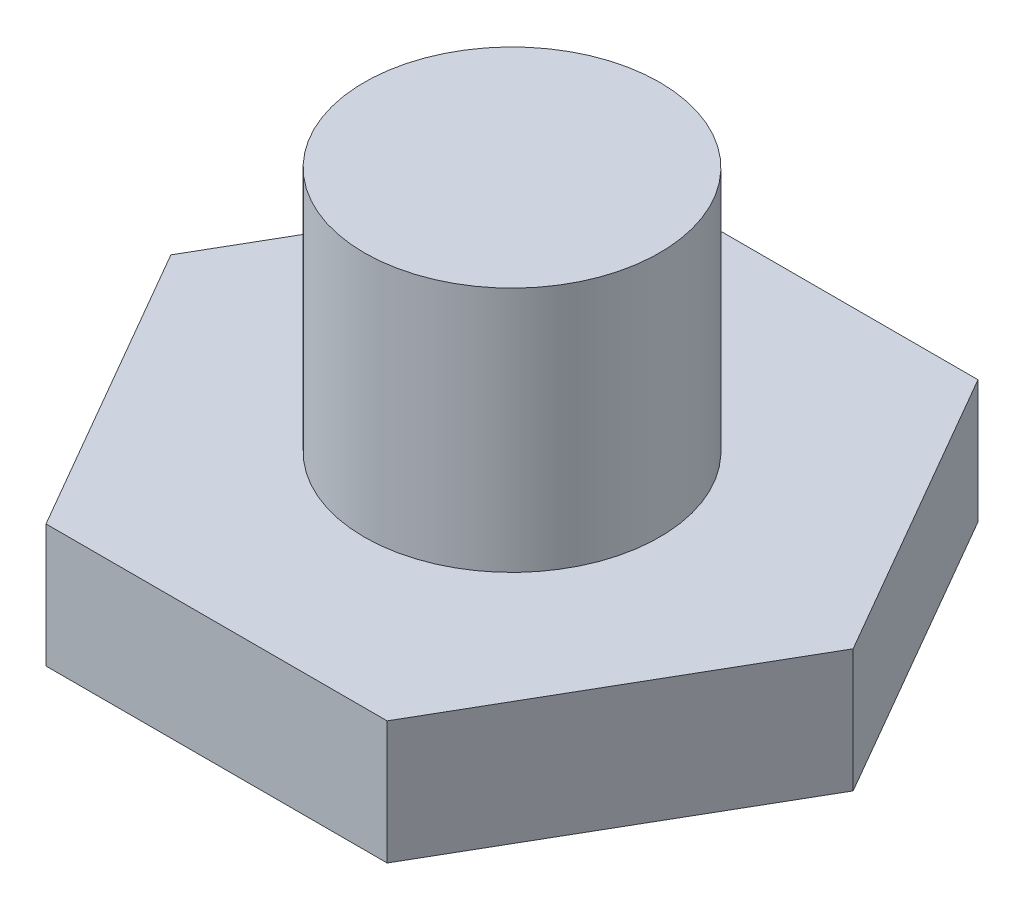
ISO-10303-21;
HEADER;
FILE_DESCRIPTION(('STEP AP214'),'2;1');
FILE_NAME('part.step','',(''),(''),'','','');
FILE_SCHEMA(('AUTOMOTIVE_DESIGN { 1 0 10303 214 1 1 1 1 }'));
ENDSEC;
DATA;
#1=APPLICATION_CONTEXT('core data for automotive mechanical design processes');
#2=APPLICATION_PROTOCOL_DEFINITION('international standard','automotive_design',2000,#1);
#3=PRODUCT_CONTEXT('',#1,'mechanical');
#4=PRODUCT('Part','Part','',(#3));
#5=PRODUCT_RELATED_PRODUCT_CATEGORY('part','',(#4));
#6=PRODUCT_DEFINITION_FORMATION('','',#4);
#7=PRODUCT_DEFINITION_CONTEXT('part definition',#1,'design');
#8=PRODUCT_DEFINITION('design','',#6,#7);
#9=PRODUCT_DEFINITION_SHAPE('','',#8);
#10=(LENGTH_UNIT() NAMED_UNIT(*) SI_UNIT(.MILLI.,.METRE.));
#11=(NAMED_UNIT(*) PLANE_ANGLE_UNIT() SI_UNIT($,.RADIAN.));
#12=(NAMED_UNIT(*) SI_UNIT($,.STERADIAN.) SOLID_ANGLE_UNIT());
#13=UNCERTAINTY_MEASURE_WITH_UNIT(LENGTH_MEASURE(1.E-05),#10,'distance_accuracy_value','');
#14=(GEOMETRIC_REPRESENTATION_CONTEXT(3) GLOBAL_UNCERTAINTY_ASSIGNED_CONTEXT((#13)) GLOBAL_UNIT_ASSIGNED_CONTEXT((#10,
#11,#12)) REPRESENTATION_CONTEXT('',''));
#15=CARTESIAN_POINT('',(0.,0.,0.));
#16=DIRECTION('',(0.,0.,1.));
#17=DIRECTION('',(1.,0.,0.));
#18=AXIS2_PLACEMENT_3D('',#15,#16,#17);
#19=CARTESIAN_POINT('',(6.92820323027565,15.,11.9999999999999));
#20=DIRECTION('',(-0.866025403784441,0.,-0.499999999999995));
#21=DIRECTION('',(-0.499999999999995,0.,0.866025403784442));
#22=AXIS2_PLACEMENT_3D('',#19,#20,#21);
#23=PLANE('',#22);
#24=DIRECTION('',(0.499999999999995,0.,-0.866025403784442));
#25=VECTOR('',#24,1.);
#26=CARTESIAN_POINT('',(6.92820323027565,5.,11.9999999999999));
#27=LINE('',#26,#25);
#28=CARTESIAN_POINT('',(6.92820323027565,5.,11.9999999999999));
#29=VERTEX_POINT('',#28);
#30=CARTESIAN_POINT('',(13.856406460551,5.,0.));
#31=VERTEX_POINT('',#30);
#32=EDGE_CURVE('E93',#29,#31,#27,.T.);
#33=ORIENTED_EDGE('',*,*,#32,.F.);
#34=DIRECTION('',(0.,-1.,0.));
#35=VECTOR('',#34,1.);
#36=CARTESIAN_POINT('',(6.92820323027565,15.,11.9999999999999));
#37=LINE('',#36,#35);
#38=CARTESIAN_POINT('',(6.92820323027565,0.,11.9999999999999));
#39=VERTEX_POINT('',#38);
#40=EDGE_CURVE('E63',#29,#39,#37,.T.);
#41=ORIENTED_EDGE('',*,*,#40,.T.);
#42=DIRECTION('',(0.499999999999995,0.,-0.866025403784441));
#43=VECTOR('',#42,1.);
#44=CARTESIAN_POINT('',(6.92820323027565,0.,11.9999999999999));
#45=LINE('',#44,#43);
#46=CARTESIAN_POINT('',(13.856406460551,0.,0.));
#47=VERTEX_POINT('',#46);
#48=EDGE_CURVE('E98',#39,#47,#45,.T.);
#49=ORIENTED_EDGE('',*,*,#48,.T.);
#50=DIRECTION('',(0.,-1.,0.));
#51=VECTOR('',#50,1.);
#52=CARTESIAN_POINT('',(13.856406460551,15.,0.));
#53=LINE('',#52,#51);
#54=EDGE_CURVE('E49',#31,#47,#53,.T.);
#55=ORIENTED_EDGE('',*,*,#54,.F.);
#56=EDGE_LOOP('',(#33,#41,#49,#55));
#57=FACE_BOUND('',#56,.T.);
#58=ADVANCED_FACE('F42',(#57),#23,.F.);
#59=CARTESIAN_POINT('',(13.856406460551,15.,0.));
#60=DIRECTION('',(-0.866025403784438,0.,0.500000000000001));
#61=DIRECTION('',(0.500000000000001,0.,0.866025403784438));
#62=AXIS2_PLACEMENT_3D('',#59,#60,#61);
#63=PLANE('',#62);
#64=DIRECTION('',(-0.500000000000001,0.,-0.866025403784438));
#65=VECTOR('',#64,1.);
#66=CARTESIAN_POINT('',(13.856406460551,5.,0.));
#67=LINE('',#66,#65);
#68=CARTESIAN_POINT('',(6.92820323027549,5.,-12.));
#69=VERTEX_POINT('',#68);
#70=EDGE_CURVE('E99',#31,#69,#67,.T.);
#71=ORIENTED_EDGE('',*,*,#70,.F.);
#72=ORIENTED_EDGE('',*,*,#54,.T.);
#73=DIRECTION('',(-0.500000000000001,0.,-0.866025403784438));
#74=VECTOR('',#73,1.);
#75=CARTESIAN_POINT('',(13.856406460551,0.,0.));
#76=LINE('',#75,#74);
#77=CARTESIAN_POINT('',(6.92820323027549,0.,-12.));
#78=VERTEX_POINT('',#77);
#79=EDGE_CURVE('E122',#47,#78,#76,.T.);
#80=ORIENTED_EDGE('',*,*,#79,.T.);
#81=DIRECTION('',(0.,-1.,0.));
#82=VECTOR('',#81,1.);
#83=CARTESIAN_POINT('',(6.92820323027549,15.,-12.));
#84=LINE('',#83,#82);
#85=EDGE_CURVE('E116',#69,#78,#84,.T.);
#86=ORIENTED_EDGE('',*,*,#85,.F.);
#87=EDGE_LOOP('',(#71,#72,#80,#86));
#88=FACE_BOUND('',#87,.T.);
#89=ADVANCED_FACE('F120',(#88),#63,.F.);
#90=CARTESIAN_POINT('',(6.92820323027549,15.,-12.));
#91=DIRECTION('',(0.,0.,1.));
#92=DIRECTION('',(1.,0.,0.));
#93=AXIS2_PLACEMENT_3D('',#90,#91,#92);
#94=PLANE('',#93);
#95=DIRECTION('',(-1.,0.,0.));
#96=VECTOR('',#95,1.);
#97=CARTESIAN_POINT('',(6.92820323027549,5.,-12.));
#98=LINE('',#97,#96);
#99=CARTESIAN_POINT('',(-6.92820323027557,5.,-12.));
#100=VERTEX_POINT('',#99);
#101=EDGE_CURVE('E149',#69,#100,#98,.T.);
#102=ORIENTED_EDGE('',*,*,#101,.F.);
#103=ORIENTED_EDGE('',*,*,#85,.T.);
#104=DIRECTION('',(-1.,0.,0.));
#105=VECTOR('',#104,1.);
#106=CARTESIAN_POINT('',(6.92820323027549,0.,-12.));
#107=LINE('',#106,#105);
#108=CARTESIAN_POINT('',(-6.92820323027557,0.,-12.));
#109=VERTEX_POINT('',#108);
#110=EDGE_CURVE('E128',#78,#109,#107,.T.);
#111=ORIENTED_EDGE('',*,*,#110,.T.);
#112=DIRECTION('',(0.,-1.,0.));
#113=VECTOR('',#112,1.);
#114=CARTESIAN_POINT('',(-6.92820323027557,15.,-12.));
#115=LINE('',#114,#113);
#116=EDGE_CURVE('E114',#100,#109,#115,.T.);
#117=ORIENTED_EDGE('',*,*,#116,.F.);
#118=EDGE_LOOP('',(#102,#103,#111,#117));
#119=FACE_BOUND('',#118,.T.);
#120=ADVANCED_FACE('F148',(#119),#94,.F.);
#121=CARTESIAN_POINT('',(-6.92820323027557,15.,-12.));
#122=DIRECTION('',(0.866025403784442,0.,0.499999999999995));
#123=DIRECTION('',(0.499999999999995,0.,-0.866025403784442));
#124=AXIS2_PLACEMENT_3D('',#121,#122,#123);
#125=PLANE('',#124);
#126=DIRECTION('',(-0.499999999999995,0.,0.866025403784442));
#127=VECTOR('',#126,1.);
#128=CARTESIAN_POINT('',(-6.92820323027557,5.,-12.));
#129=LINE('',#128,#127);
#130=CARTESIAN_POINT('',(-13.856406460551,5.,0.));
#131=VERTEX_POINT('',#130);
#132=EDGE_CURVE('E145',#100,#131,#129,.T.);
#133=ORIENTED_EDGE('',*,*,#132,.F.);
#134=ORIENTED_EDGE('',*,*,#116,.T.);
#135=DIRECTION('',(-0.499999999999995,0.,0.866025403784442));
#136=VECTOR('',#135,1.);
#137=CARTESIAN_POINT('',(-6.92820323027557,0.,-12.));
#138=LINE('',#137,#136);
#139=CARTESIAN_POINT('',(-13.856406460551,0.,0.));
#140=VERTEX_POINT('',#139);
#141=EDGE_CURVE('E134',#109,#140,#138,.T.);
#142=ORIENTED_EDGE('',*,*,#141,.T.);
#143=DIRECTION('',(0.,-1.,0.));
#144=VECTOR('',#143,1.);
#145=CARTESIAN_POINT('',(-13.856406460551,15.,0.));
#146=LINE('',#145,#144);
#147=EDGE_CURVE('E107',#131,#140,#146,.T.);
#148=ORIENTED_EDGE('',*,*,#147,.F.);
#149=EDGE_LOOP('',(#133,#134,#142,#148));
#150=FACE_BOUND('',#149,.T.);
#151=ADVANCED_FACE('F143',(#150),#125,.F.);
#152=CARTESIAN_POINT('',(-13.856406460551,15.,0.));
#153=DIRECTION('',(0.866025403784435,0.,-0.500000000000007));
#154=DIRECTION('',(-0.500000000000007,0.,-0.866025403784435));
#155=AXIS2_PLACEMENT_3D('',#152,#153,#154);
#156=PLANE('',#155);
#157=DIRECTION('',(0.500000000000007,0.,0.866025403784435));
#158=VECTOR('',#157,1.);
#159=CARTESIAN_POINT('',(-13.856406460551,5.,0.));
#160=LINE('',#159,#158);
#161=CARTESIAN_POINT('',(-6.9282032302754,5.,12.0000000000001));
#162=VERTEX_POINT('',#161);
#163=EDGE_CURVE('E55',#131,#162,#160,.T.);
#164=ORIENTED_EDGE('',*,*,#163,.F.);
#165=ORIENTED_EDGE('',*,*,#147,.T.);
#166=DIRECTION('',(0.500000000000007,0.,0.866025403784434));
#167=VECTOR('',#166,1.);
#168=CARTESIAN_POINT('',(-13.856406460551,0.,0.));
#169=LINE('',#168,#167);
#170=CARTESIAN_POINT('',(-6.9282032302754,0.,12.0000000000001));
#171=VERTEX_POINT('',#170);
#172=EDGE_CURVE('E109',#140,#171,#169,.T.);
#173=ORIENTED_EDGE('',*,*,#172,.T.);
#174=DIRECTION('',(0.,-1.,0.));
#175=VECTOR('',#174,1.);
#176=CARTESIAN_POINT('',(-6.9282032302754,15.,12.0000000000001));
#177=LINE('',#176,#175);
#178=EDGE_CURVE('E105',#162,#171,#177,.T.);
#179=ORIENTED_EDGE('',*,*,#178,.F.);
#180=EDGE_LOOP('',(#164,#165,#173,#179));
#181=FACE_BOUND('',#180,.T.);
#182=ADVANCED_FACE('F139',(#181),#156,.F.);
#183=CARTESIAN_POINT('',(-6.9282032302754,15.,12.0000000000001));
#184=DIRECTION('',(0.,0.,-1.));
#185=DIRECTION('',(-1.,0.,0.));
#186=AXIS2_PLACEMENT_3D('',#183,#184,#185);
#187=PLANE('',#186);
#188=DIRECTION('',(1.,0.,0.));
#189=VECTOR('',#188,1.);
#190=CARTESIAN_POINT('',(-6.9282032302754,5.,12.0000000000001));
#191=LINE('',#190,#189);
#192=EDGE_CURVE('E13',#162,#29,#191,.T.);
#193=ORIENTED_EDGE('',*,*,#192,.F.);
#194=ORIENTED_EDGE('',*,*,#178,.T.);
#195=DIRECTION('',(1.,0.,0.));
#196=VECTOR('',#195,1.);
#197=CARTESIAN_POINT('',(-6.9282032302754,0.,12.0000000000001));
#198=LINE('',#197,#196);
#199=EDGE_CURVE('E103',#171,#39,#198,.T.);
#200=ORIENTED_EDGE('',*,*,#199,.T.);
#201=ORIENTED_EDGE('',*,*,#40,.F.);
#202=EDGE_LOOP('',(#193,#194,#200,#201));
#203=FACE_BOUND('',#202,.T.);
#204=ADVANCED_FACE('F101',(#203),#187,.F.);
#205=CARTESIAN_POINT('',(0.,0.,0.));
#206=DIRECTION('',(0.,1.,0.));
#207=DIRECTION('',(0.,0.,1.));
#208=AXIS2_PLACEMENT_3D('',#205,#206,#207);
#209=PLANE('',#208);
#210=ORIENTED_EDGE('',*,*,#48,.F.);
#211=ORIENTED_EDGE('',*,*,#199,.F.);
#212=ORIENTED_EDGE('',*,*,#172,.F.);
#213=ORIENTED_EDGE('',*,*,#141,.F.);
#214=ORIENTED_EDGE('',*,*,#110,.F.);
#215=ORIENTED_EDGE('',*,*,#79,.F.);
#216=EDGE_LOOP('',(#210,#211,#212,#213,#214,#215));
#217=FACE_BOUND('',#216,.T.);
#218=ADVANCED_FACE('F125',(#217),#209,.F.);
#219=CARTESIAN_POINT('',(0.,5.,0.));
#220=DIRECTION('',(0.,1.,0.));
#221=DIRECTION('',(0.,0.,1.));
#222=AXIS2_PLACEMENT_3D('',#219,#220,#221);
#223=PLANE('',#222);
#224=CARTESIAN_POINT('',(0.,5.,0.));
#225=DIRECTION('',(0.,1.,0.));
#226=DIRECTION('',(0.,0.,1.));
#227=AXIS2_PLACEMENT_3D('',#224,#225,#226);
#228=CIRCLE('',#227,6.);
#229=CARTESIAN_POINT('',(0.,5.,6.));
#230=VERTEX_POINT('',#229);
#231=EDGE_CURVE('E154',#230,#230,#228,.F.);
#232=ORIENTED_EDGE('',*,*,#231,.T.);
#233=EDGE_LOOP('',(#232));
#234=FACE_BOUND('',#233,.T.);
#235=ORIENTED_EDGE('',*,*,#32,.T.);
#236=ORIENTED_EDGE('',*,*,#70,.T.);
#237=ORIENTED_EDGE('',*,*,#101,.T.);
#238=ORIENTED_EDGE('',*,*,#132,.T.);
#239=ORIENTED_EDGE('',*,*,#163,.T.);
#240=ORIENTED_EDGE('',*,*,#192,.T.);
#241=EDGE_LOOP('',(#235,#236,#237,#238,#239,#240));
#242=FACE_BOUND('',#241,.T.);
#243=ADVANCED_FACE('F92',(#234,#242),#223,.T.);
#244=CARTESIAN_POINT('',(0.,-37.0272116152433,0.));
#245=DIRECTION('',(0.,1.,0.));
#246=DIRECTION('',(0.,0.,1.));
#247=AXIS2_PLACEMENT_3D('',#244,#245,#246);
#248=CYLINDRICAL_SURFACE('',#247,6.);
#249=ORIENTED_EDGE('',*,*,#231,.F.);
#250=EDGE_LOOP('',(#249));
#251=FACE_BOUND('',#250,.T.);
#252=CARTESIAN_POINT('',(0.,15.,0.));
#253=DIRECTION('',(0.,1.,0.));
#254=DIRECTION('',(0.,0.,1.));
#255=AXIS2_PLACEMENT_3D('',#252,#253,#254);
#256=CIRCLE('',#255,6.);
#257=CARTESIAN_POINT('',(0.,15.,6.));
#258=VERTEX_POINT('',#257);
#259=EDGE_CURVE('E157',#258,#258,#256,.T.);
#260=ORIENTED_EDGE('',*,*,#259,.F.);
#261=EDGE_LOOP('',(#260));
#262=FACE_BOUND('',#261,.T.);
#263=ADVANCED_FACE('F163',(#251,#262),#248,.T.);
#264=CARTESIAN_POINT('',(0.,15.,0.));
#265=DIRECTION('',(0.,1.,0.));
#266=DIRECTION('',(0.,0.,1.));
#267=AXIS2_PLACEMENT_3D('',#264,#265,#266);
#268=PLANE('',#267);
#269=ORIENTED_EDGE('',*,*,#259,.T.);
#270=EDGE_LOOP('',(#269));
#271=FACE_BOUND('',#270,.T.);
#272=ADVANCED_FACE('F161',(#271),#268,.T.);
#273=CLOSED_SHELL('',(#58,#89,#120,#151,#182,#204,#218,#243,#263,#272));
#274=MANIFOLD_SOLID_BREP('B2',#273);
#275=ADVANCED_BREP_SHAPE_REPRESENTATION('',(#18,#274),#14);
#276=SHAPE_DEFINITION_REPRESENTATION(#9,#275);
ENDSEC;
END-ISO-10303-21;
